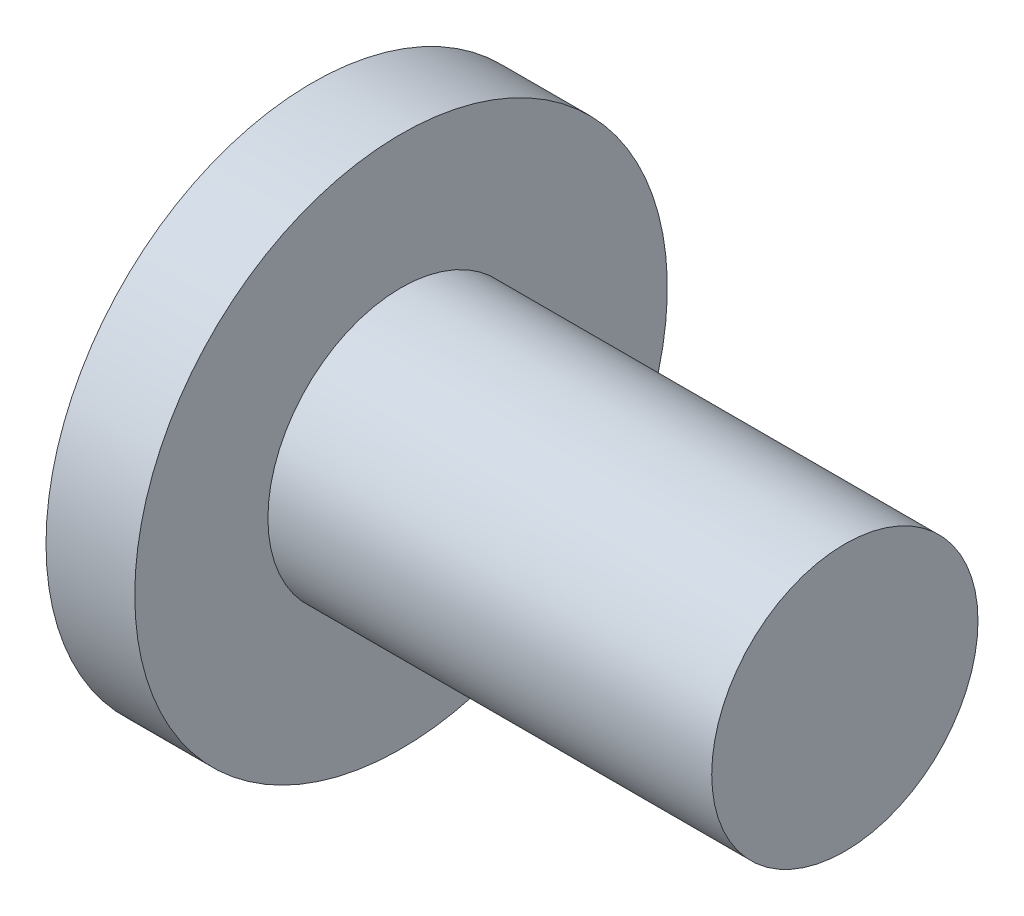
ISO-10303-21;
HEADER;
FILE_DESCRIPTION(('STEP AP214'),'2;1');
FILE_NAME('part.step','',(''),(''),'','','');
FILE_SCHEMA(('AUTOMOTIVE_DESIGN { 1 0 10303 214 1 1 1 1 }'));
ENDSEC;
DATA;
#1=APPLICATION_CONTEXT('core data for automotive mechanical design processes');
#2=APPLICATION_PROTOCOL_DEFINITION('international standard','automotive_design',2000,#1);
#3=PRODUCT_CONTEXT('',#1,'mechanical');
#4=PRODUCT('Part','Part','',(#3));
#5=PRODUCT_RELATED_PRODUCT_CATEGORY('part','',(#4));
#6=PRODUCT_DEFINITION_FORMATION('','',#4);
#7=PRODUCT_DEFINITION_CONTEXT('part definition',#1,'design');
#8=PRODUCT_DEFINITION('design','',#6,#7);
#9=PRODUCT_DEFINITION_SHAPE('','',#8);
#10=(LENGTH_UNIT() NAMED_UNIT(*) SI_UNIT(.MILLI.,.METRE.));
#11=(NAMED_UNIT(*) PLANE_ANGLE_UNIT() SI_UNIT($,.RADIAN.));
#12=(NAMED_UNIT(*) SI_UNIT($,.STERADIAN.) SOLID_ANGLE_UNIT());
#13=UNCERTAINTY_MEASURE_WITH_UNIT(LENGTH_MEASURE(1.E-05),#10,'distance_accuracy_value','');
#14=(GEOMETRIC_REPRESENTATION_CONTEXT(3) GLOBAL_UNCERTAINTY_ASSIGNED_CONTEXT((#13)) GLOBAL_UNIT_ASSIGNED_CONTEXT((#10,
#11,#12)) REPRESENTATION_CONTEXT('',''));
#15=CARTESIAN_POINT('',(0.,0.,0.));
#16=DIRECTION('',(0.,0.,1.));
#17=DIRECTION('',(1.,0.,0.));
#18=AXIS2_PLACEMENT_3D('',#15,#16,#17);
#19=CARTESIAN_POINT('',(0.,0.,0.));
#20=DIRECTION('',(-1.,0.,0.));
#21=DIRECTION('',(0.,0.,1.));
#22=AXIS2_PLACEMENT_3D('',#19,#20,#21);
#23=PLANE('',#22);
#24=CARTESIAN_POINT('',(0.,0.,0.));
#25=DIRECTION('',(-1.,0.,0.));
#26=DIRECTION('',(0.,0.,1.));
#27=AXIS2_PLACEMENT_3D('',#24,#25,#26);
#28=CIRCLE('',#27,3.);
#29=CARTESIAN_POINT('',(0.,0.,3.));
#30=VERTEX_POINT('',#29);
#31=EDGE_CURVE('E10',#30,#30,#28,.T.);
#32=ORIENTED_EDGE('',*,*,#31,.F.);
#33=EDGE_LOOP('',(#32));
#34=FACE_BOUND('',#33,.T.);
#35=ADVANCED_FACE('F40',(#34),#23,.F.);
#36=CARTESIAN_POINT('',(-12.,0.,0.));
#37=DIRECTION('',(-1.,0.,0.));
#38=DIRECTION('',(0.,0.,1.));
#39=AXIS2_PLACEMENT_3D('',#36,#37,#38);
#40=CYLINDRICAL_SURFACE('',#39,3.);
#41=CARTESIAN_POINT('',(-10.,0.,0.));
#42=DIRECTION('',(-1.,0.,0.));
#43=DIRECTION('',(0.,0.,1.));
#44=AXIS2_PLACEMENT_3D('',#41,#42,#43);
#45=CIRCLE('',#44,3.);
#46=CARTESIAN_POINT('',(-10.,0.,3.));
#47=VERTEX_POINT('',#46);
#48=EDGE_CURVE('E43',#47,#47,#45,.T.);
#49=ORIENTED_EDGE('',*,*,#48,.F.);
#50=EDGE_LOOP('',(#49));
#51=FACE_BOUND('',#50,.T.);
#52=ORIENTED_EDGE('',*,*,#31,.T.);
#53=EDGE_LOOP('',(#52));
#54=FACE_BOUND('',#53,.T.);
#55=ADVANCED_FACE('F70',(#51,#54),#40,.T.);
#56=CARTESIAN_POINT('',(-10.,3.,0.));
#57=DIRECTION('',(-1.,0.,0.));
#58=DIRECTION('',(0.,0.,1.));
#59=AXIS2_PLACEMENT_3D('',#56,#57,#58);
#60=PLANE('',#59);
#61=CARTESIAN_POINT('',(-10.,0.,0.));
#62=DIRECTION('',(-1.,0.,0.));
#63=DIRECTION('',(0.,0.,1.));
#64=AXIS2_PLACEMENT_3D('',#61,#62,#63);
#65=CIRCLE('',#64,6.);
#66=CARTESIAN_POINT('',(-10.,0.,6.));
#67=VERTEX_POINT('',#66);
#68=EDGE_CURVE('E50',#67,#67,#65,.T.);
#69=ORIENTED_EDGE('',*,*,#68,.F.);
#70=EDGE_LOOP('',(#69));
#71=FACE_BOUND('',#70,.T.);
#72=ORIENTED_EDGE('',*,*,#48,.T.);
#73=EDGE_LOOP('',(#72));
#74=FACE_BOUND('',#73,.T.);
#75=ADVANCED_FACE('F62',(#71,#74),#60,.F.);
#76=CARTESIAN_POINT('',(-12.,0.,0.));
#77=DIRECTION('',(-1.,0.,0.));
#78=DIRECTION('',(0.,0.,1.));
#79=AXIS2_PLACEMENT_3D('',#76,#77,#78);
#80=CYLINDRICAL_SURFACE('',#79,6.);
#81=CARTESIAN_POINT('',(-12.,0.,0.));
#82=DIRECTION('',(-1.,0.,0.));
#83=DIRECTION('',(0.,0.,1.));
#84=AXIS2_PLACEMENT_3D('',#81,#82,#83);
#85=CIRCLE('',#84,6.);
#86=CARTESIAN_POINT('',(-12.,0.,6.));
#87=VERTEX_POINT('',#86);
#88=EDGE_CURVE('E51',#87,#87,#85,.T.);
#89=ORIENTED_EDGE('',*,*,#88,.F.);
#90=EDGE_LOOP('',(#89));
#91=FACE_BOUND('',#90,.T.);
#92=ORIENTED_EDGE('',*,*,#68,.T.);
#93=EDGE_LOOP('',(#92));
#94=FACE_BOUND('',#93,.T.);
#95=ADVANCED_FACE('F56',(#91,#94),#80,.T.);
#96=CARTESIAN_POINT('',(-12.,6.,0.));
#97=DIRECTION('',(1.,0.,0.));
#98=DIRECTION('',(0.,0.,-1.));
#99=AXIS2_PLACEMENT_3D('',#96,#97,#98);
#100=PLANE('',#99);
#101=ORIENTED_EDGE('',*,*,#88,.T.);
#102=EDGE_LOOP('',(#101));
#103=FACE_BOUND('',#102,.T.);
#104=ADVANCED_FACE('F60',(#103),#100,.F.);
#105=CLOSED_SHELL('',(#35,#55,#75,#95,#104));
#106=MANIFOLD_SOLID_BREP('B2',#105);
#107=ADVANCED_BREP_SHAPE_REPRESENTATION('',(#18,#106),#14);
#108=SHAPE_DEFINITION_REPRESENTATION(#9,#107);
ENDSEC;
END-ISO-10303-21;
